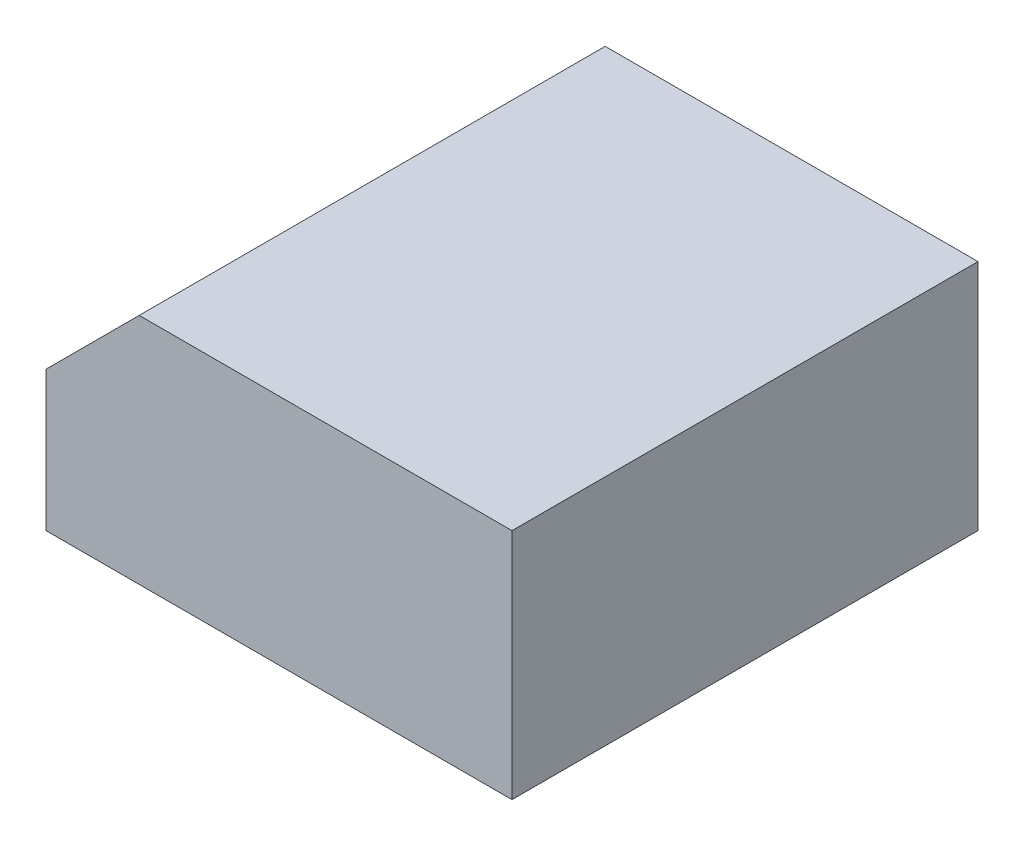
ISO-10303-21;
HEADER;
FILE_DESCRIPTION(('STEP AP214'),'2;1');
FILE_NAME('part.step','',(''),(''),'','','');
FILE_SCHEMA(('AUTOMOTIVE_DESIGN { 1 0 10303 214 1 1 1 1 }'));
ENDSEC;
DATA;
#1=APPLICATION_CONTEXT('core data for automotive mechanical design processes');
#2=APPLICATION_PROTOCOL_DEFINITION('international standard','automotive_design',2000,#1);
#3=PRODUCT_CONTEXT('',#1,'mechanical');
#4=PRODUCT('Part','Part','',(#3));
#5=PRODUCT_RELATED_PRODUCT_CATEGORY('part','',(#4));
#6=PRODUCT_DEFINITION_FORMATION('','',#4);
#7=PRODUCT_DEFINITION_CONTEXT('part definition',#1,'design');
#8=PRODUCT_DEFINITION('design','',#6,#7);
#9=PRODUCT_DEFINITION_SHAPE('','',#8);
#10=(LENGTH_UNIT() NAMED_UNIT(*) SI_UNIT(.MILLI.,.METRE.));
#11=(NAMED_UNIT(*) PLANE_ANGLE_UNIT() SI_UNIT($,.RADIAN.));
#12=(NAMED_UNIT(*) SI_UNIT($,.STERADIAN.) SOLID_ANGLE_UNIT());
#13=UNCERTAINTY_MEASURE_WITH_UNIT(LENGTH_MEASURE(1.E-05),#10,'distance_accuracy_value','');
#14=(GEOMETRIC_REPRESENTATION_CONTEXT(3) GLOBAL_UNCERTAINTY_ASSIGNED_CONTEXT((#13)) GLOBAL_UNIT_ASSIGNED_CONTEXT((#10,
#11,#12)) REPRESENTATION_CONTEXT('',''));
#15=CARTESIAN_POINT('',(0.,0.,0.));
#16=DIRECTION('',(0.,0.,1.));
#17=DIRECTION('',(1.,0.,0.));
#18=AXIS2_PLACEMENT_3D('',#15,#16,#17);
#19=CARTESIAN_POINT('',(-500.,0.,500.));
#20=DIRECTION('',(1.,0.,0.));
#21=DIRECTION('',(0.,0.,-1.));
#22=AXIS2_PLACEMENT_3D('',#19,#20,#21);
#23=PLANE('',#22);
#24=DIRECTION('',(0.,-1.,0.));
#25=VECTOR('',#24,1.);
#26=CARTESIAN_POINT('',(-500.,0.,-500.));
#27=LINE('',#26,#25);
#28=CARTESIAN_POINT('',(-500.,299.999999999999,-500.));
#29=VERTEX_POINT('',#28);
#30=CARTESIAN_POINT('',(-500.,0.,-500.));
#31=VERTEX_POINT('',#30);
#32=EDGE_CURVE('E142',#29,#31,#27,.T.);
#33=ORIENTED_EDGE('',*,*,#32,.T.);
#34=DIRECTION('',(0.,0.,-1.));
#35=VECTOR('',#34,1.);
#36=CARTESIAN_POINT('',(-500.,0.,500.));
#37=LINE('',#36,#35);
#38=CARTESIAN_POINT('',(-500.,0.,500.));
#39=VERTEX_POINT('',#38);
#40=EDGE_CURVE('E11',#39,#31,#37,.T.);
#41=ORIENTED_EDGE('',*,*,#40,.F.);
#42=DIRECTION('',(0.,-1.,0.));
#43=VECTOR('',#42,1.);
#44=CARTESIAN_POINT('',(-500.,0.,500.));
#45=LINE('',#44,#43);
#46=CARTESIAN_POINT('',(-500.,299.999999999999,500.));
#47=VERTEX_POINT('',#46);
#48=EDGE_CURVE('E146',#47,#39,#45,.T.);
#49=ORIENTED_EDGE('',*,*,#48,.F.);
#50=DIRECTION('',(0.,0.,-1.));
#51=VECTOR('',#50,1.);
#52=CARTESIAN_POINT('',(-500.,299.999999999999,500.));
#53=LINE('',#52,#51);
#54=EDGE_CURVE('E158',#47,#29,#53,.T.);
#55=ORIENTED_EDGE('',*,*,#54,.T.);
#56=EDGE_LOOP('',(#33,#41,#49,#55));
#57=FACE_BOUND('',#56,.T.);
#58=ADVANCED_FACE('F38',(#57),#23,.F.);
#59=CARTESIAN_POINT('',(-500.,0.,500.));
#60=DIRECTION('',(0.,1.,0.));
#61=DIRECTION('',(-1.,0.,0.));
#62=AXIS2_PLACEMENT_3D('',#59,#60,#61);
#63=PLANE('',#62);
#64=DIRECTION('',(1.,0.,0.));
#65=VECTOR('',#64,1.);
#66=CARTESIAN_POINT('',(-500.,0.,-500.));
#67=LINE('',#66,#65);
#68=CARTESIAN_POINT('',(500.,1.83697019872103E-13,-500.));
#69=VERTEX_POINT('',#68);
#70=EDGE_CURVE('E161',#31,#69,#67,.T.);
#71=ORIENTED_EDGE('',*,*,#70,.T.);
#72=DIRECTION('',(0.,0.,-1.));
#73=VECTOR('',#72,1.);
#74=CARTESIAN_POINT('',(500.,1.83697019872103E-13,500.));
#75=LINE('',#74,#73);
#76=CARTESIAN_POINT('',(500.,1.83697019872103E-13,500.));
#77=VERTEX_POINT('',#76);
#78=EDGE_CURVE('E46',#77,#69,#75,.T.);
#79=ORIENTED_EDGE('',*,*,#78,.F.);
#80=DIRECTION('',(1.,0.,0.));
#81=VECTOR('',#80,1.);
#82=CARTESIAN_POINT('',(-500.,0.,500.));
#83=LINE('',#82,#81);
#84=EDGE_CURVE('E149',#39,#77,#83,.T.);
#85=ORIENTED_EDGE('',*,*,#84,.F.);
#86=ORIENTED_EDGE('',*,*,#40,.T.);
#87=EDGE_LOOP('',(#71,#79,#85,#86));
#88=FACE_BOUND('',#87,.T.);
#89=ADVANCED_FACE('F200',(#88),#63,.F.);
#90=CARTESIAN_POINT('',(500.,500.,500.));
#91=DIRECTION('',(-1.,0.,0.));
#92=DIRECTION('',(0.,0.,1.));
#93=AXIS2_PLACEMENT_3D('',#90,#91,#92);
#94=PLANE('',#93);
#95=DIRECTION('',(0.,1.,0.));
#96=VECTOR('',#95,1.);
#97=CARTESIAN_POINT('',(500.,500.,-500.));
#98=LINE('',#97,#96);
#99=CARTESIAN_POINT('',(500.,500.,-500.));
#100=VERTEX_POINT('',#99);
#101=EDGE_CURVE('E163',#69,#100,#98,.T.);
#102=ORIENTED_EDGE('',*,*,#101,.T.);
#103=DIRECTION('',(0.,0.,-1.));
#104=VECTOR('',#103,1.);
#105=CARTESIAN_POINT('',(500.,500.,500.));
#106=LINE('',#105,#104);
#107=CARTESIAN_POINT('',(500.,500.,500.));
#108=VERTEX_POINT('',#107);
#109=EDGE_CURVE('E173',#108,#100,#106,.T.);
#110=ORIENTED_EDGE('',*,*,#109,.F.);
#111=DIRECTION('',(0.,1.,0.));
#112=VECTOR('',#111,1.);
#113=CARTESIAN_POINT('',(500.,500.,500.));
#114=LINE('',#113,#112);
#115=EDGE_CURVE('E152',#77,#108,#114,.T.);
#116=ORIENTED_EDGE('',*,*,#115,.F.);
#117=ORIENTED_EDGE('',*,*,#78,.T.);
#118=EDGE_LOOP('',(#102,#110,#116,#117));
#119=FACE_BOUND('',#118,.T.);
#120=ADVANCED_FACE('F180',(#119),#94,.F.);
#121=CARTESIAN_POINT('',(-300.,500.,500.));
#122=DIRECTION('',(0.,-1.,0.));
#123=DIRECTION('',(1.,0.,0.));
#124=AXIS2_PLACEMENT_3D('',#121,#122,#123);
#125=PLANE('',#124);
#126=DIRECTION('',(-1.,0.,0.));
#127=VECTOR('',#126,1.);
#128=CARTESIAN_POINT('',(-300.,500.,-500.));
#129=LINE('',#128,#127);
#130=CARTESIAN_POINT('',(-300.,500.,-500.));
#131=VERTEX_POINT('',#130);
#132=EDGE_CURVE('E165',#100,#131,#129,.T.);
#133=ORIENTED_EDGE('',*,*,#132,.T.);
#134=DIRECTION('',(0.,0.,-1.));
#135=VECTOR('',#134,1.);
#136=CARTESIAN_POINT('',(-300.,500.,500.));
#137=LINE('',#136,#135);
#138=CARTESIAN_POINT('',(-300.,500.,500.));
#139=VERTEX_POINT('',#138);
#140=EDGE_CURVE('E170',#139,#131,#137,.T.);
#141=ORIENTED_EDGE('',*,*,#140,.F.);
#142=DIRECTION('',(-1.,0.,0.));
#143=VECTOR('',#142,1.);
#144=CARTESIAN_POINT('',(-300.,500.,500.));
#145=LINE('',#144,#143);
#146=EDGE_CURVE('E154',#108,#139,#145,.T.);
#147=ORIENTED_EDGE('',*,*,#146,.F.);
#148=ORIENTED_EDGE('',*,*,#109,.T.);
#149=EDGE_LOOP('',(#133,#141,#147,#148));
#150=FACE_BOUND('',#149,.T.);
#151=ADVANCED_FACE('F190',(#150),#125,.F.);
#152=CARTESIAN_POINT('',(-500.,299.999999999999,500.));
#153=DIRECTION('',(0.707106781186549,-0.707106781186546,0.));
#154=DIRECTION('',(0.707106781186546,0.707106781186549,0.));
#155=AXIS2_PLACEMENT_3D('',#152,#153,#154);
#156=PLANE('',#155);
#157=DIRECTION('',(-0.707106781186546,-0.707106781186549,0.));
#158=VECTOR('',#157,1.);
#159=CARTESIAN_POINT('',(-500.,299.999999999999,-500.));
#160=LINE('',#159,#158);
#161=EDGE_CURVE('E150',#131,#29,#160,.T.);
#162=ORIENTED_EDGE('',*,*,#161,.T.);
#163=ORIENTED_EDGE('',*,*,#54,.F.);
#164=DIRECTION('',(-0.707106781186546,-0.707106781186549,0.));
#165=VECTOR('',#164,1.);
#166=CARTESIAN_POINT('',(-500.,299.999999999999,500.));
#167=LINE('',#166,#165);
#168=EDGE_CURVE('E156',#139,#47,#167,.T.);
#169=ORIENTED_EDGE('',*,*,#168,.F.);
#170=ORIENTED_EDGE('',*,*,#140,.T.);
#171=EDGE_LOOP('',(#162,#163,#169,#170));
#172=FACE_BOUND('',#171,.T.);
#173=ADVANCED_FACE('F194',(#172),#156,.F.);
#174=CARTESIAN_POINT('',(0.,0.,500.));
#175=DIRECTION('',(0.,0.,-1.));
#176=DIRECTION('',(-1.,0.,0.));
#177=AXIS2_PLACEMENT_3D('',#174,#175,#176);
#178=PLANE('',#177);
#179=ORIENTED_EDGE('',*,*,#48,.T.);
#180=ORIENTED_EDGE('',*,*,#84,.T.);
#181=ORIENTED_EDGE('',*,*,#115,.T.);
#182=ORIENTED_EDGE('',*,*,#146,.T.);
#183=ORIENTED_EDGE('',*,*,#168,.T.);
#184=EDGE_LOOP('',(#179,#180,#181,#182,#183));
#185=FACE_BOUND('',#184,.T.);
#186=ADVANCED_FACE('F198',(#185),#178,.F.);
#187=CARTESIAN_POINT('',(0.,0.,-500.));
#188=DIRECTION('',(0.,0.,-1.));
#189=DIRECTION('',(-1.,0.,0.));
#190=AXIS2_PLACEMENT_3D('',#187,#188,#189);
#191=PLANE('',#190);
#192=ORIENTED_EDGE('',*,*,#32,.F.);
#193=ORIENTED_EDGE('',*,*,#161,.F.);
#194=ORIENTED_EDGE('',*,*,#132,.F.);
#195=ORIENTED_EDGE('',*,*,#101,.F.);
#196=ORIENTED_EDGE('',*,*,#70,.F.);
#197=EDGE_LOOP('',(#192,#193,#194,#195,#196));
#198=FACE_BOUND('',#197,.T.);
#199=ADVANCED_FACE('F186',(#198),#191,.T.);
#200=CLOSED_SHELL('',(#58,#89,#120,#151,#173,#186,#199));
#201=CARTESIAN_POINT('',(0.,490.,0.));
#202=DIRECTION('',(0.,1.,0.));
#203=DIRECTION('',(-1.,0.,0.));
#204=AXIS2_PLACEMENT_3D('',#201,#202,#203);
#205=PLANE('',#204);
#206=DIRECTION('',(0.,0.,1.));
#207=VECTOR('',#206,1.);
#208=CARTESIAN_POINT('',(-275.,490.,-475.));
#209=LINE('',#208,#207);
#210=CARTESIAN_POINT('',(-275.,490.,-475.));
#211=VERTEX_POINT('',#210);
#212=CARTESIAN_POINT('',(-275.,490.,475.));
#213=VERTEX_POINT('',#212);
#214=EDGE_CURVE('E123',#211,#213,#209,.T.);
#215=ORIENTED_EDGE('',*,*,#214,.F.);
#216=DIRECTION('',(-1.,0.,0.));
#217=VECTOR('',#216,1.);
#218=CARTESIAN_POINT('',(-275.,490.,-475.));
#219=LINE('',#218,#217);
#220=CARTESIAN_POINT('',(475.,490.,-475.));
#221=VERTEX_POINT('',#220);
#222=EDGE_CURVE('E53',#221,#211,#219,.T.);
#223=ORIENTED_EDGE('',*,*,#222,.F.);
#224=DIRECTION('',(0.,0.,-1.));
#225=VECTOR('',#224,1.);
#226=CARTESIAN_POINT('',(475.,490.,-475.));
#227=LINE('',#226,#225);
#228=CARTESIAN_POINT('',(475.,490.,475.));
#229=VERTEX_POINT('',#228);
#230=EDGE_CURVE('E61',#229,#221,#227,.T.);
#231=ORIENTED_EDGE('',*,*,#230,.F.);
#232=DIRECTION('',(1.,0.,0.));
#233=VECTOR('',#232,1.);
#234=CARTESIAN_POINT('',(-275.,490.,475.));
#235=LINE('',#234,#233);
#236=EDGE_CURVE('E113',#213,#229,#235,.T.);
#237=ORIENTED_EDGE('',*,*,#236,.F.);
#238=EDGE_LOOP('',(#215,#223,#231,#237));
#239=FACE_BOUND('',#238,.T.);
#240=ADVANCED_FACE('F128',(#239),#205,.F.);
#241=CARTESIAN_POINT('',(0.,20.,0.));
#242=DIRECTION('',(0.,1.,0.));
#243=DIRECTION('',(-1.,0.,0.));
#244=AXIS2_PLACEMENT_3D('',#241,#242,#243);
#245=PLANE('',#244);
#246=DIRECTION('',(0.,0.,1.));
#247=VECTOR('',#246,1.);
#248=CARTESIAN_POINT('',(-275.,20.,-475.));
#249=LINE('',#248,#247);
#250=CARTESIAN_POINT('',(-275.,20.,-475.));
#251=VERTEX_POINT('',#250);
#252=CARTESIAN_POINT('',(-275.,20.,475.));
#253=VERTEX_POINT('',#252);
#254=EDGE_CURVE('E133',#251,#253,#249,.T.);
#255=ORIENTED_EDGE('',*,*,#254,.T.);
#256=DIRECTION('',(1.,0.,0.));
#257=VECTOR('',#256,1.);
#258=CARTESIAN_POINT('',(-275.,20.,475.));
#259=LINE('',#258,#257);
#260=CARTESIAN_POINT('',(475.,20.,475.));
#261=VERTEX_POINT('',#260);
#262=EDGE_CURVE('E115',#253,#261,#259,.T.);
#263=ORIENTED_EDGE('',*,*,#262,.T.);
#264=DIRECTION('',(0.,0.,-1.));
#265=VECTOR('',#264,1.);
#266=CARTESIAN_POINT('',(475.,20.,-475.));
#267=LINE('',#266,#265);
#268=CARTESIAN_POINT('',(475.,20.,-475.));
#269=VERTEX_POINT('',#268);
#270=EDGE_CURVE('E136',#261,#269,#267,.T.);
#271=ORIENTED_EDGE('',*,*,#270,.T.);
#272=DIRECTION('',(-1.,0.,0.));
#273=VECTOR('',#272,1.);
#274=CARTESIAN_POINT('',(-275.,20.,-475.));
#275=LINE('',#274,#273);
#276=EDGE_CURVE('E120',#269,#251,#275,.T.);
#277=ORIENTED_EDGE('',*,*,#276,.T.);
#278=EDGE_LOOP('',(#255,#263,#271,#277));
#279=FACE_BOUND('',#278,.T.);
#280=ADVANCED_FACE('F226',(#279),#245,.T.);
#281=CARTESIAN_POINT('',(-275.,20.,475.));
#282=DIRECTION('',(0.,0.,1.));
#283=DIRECTION('',(1.,0.,0.));
#284=AXIS2_PLACEMENT_3D('',#281,#282,#283);
#285=PLANE('',#284);
#286=ORIENTED_EDGE('',*,*,#236,.T.);
#287=DIRECTION('',(0.,1.,0.));
#288=VECTOR('',#287,1.);
#289=CARTESIAN_POINT('',(475.,20.,475.));
#290=LINE('',#289,#288);
#291=EDGE_CURVE('E119',#261,#229,#290,.T.);
#292=ORIENTED_EDGE('',*,*,#291,.F.);
#293=ORIENTED_EDGE('',*,*,#262,.F.);
#294=DIRECTION('',(0.,1.,0.));
#295=VECTOR('',#294,1.);
#296=CARTESIAN_POINT('',(-275.,20.,475.));
#297=LINE('',#296,#295);
#298=EDGE_CURVE('E109',#253,#213,#297,.T.);
#299=ORIENTED_EDGE('',*,*,#298,.T.);
#300=EDGE_LOOP('',(#286,#292,#293,#299));
#301=FACE_BOUND('',#300,.T.);
#302=ADVANCED_FACE('F111',(#301),#285,.F.);
#303=CARTESIAN_POINT('',(475.,20.,-475.));
#304=DIRECTION('',(1.,0.,0.));
#305=DIRECTION('',(0.,0.,-1.));
#306=AXIS2_PLACEMENT_3D('',#303,#304,#305);
#307=PLANE('',#306);
#308=ORIENTED_EDGE('',*,*,#230,.T.);
#309=DIRECTION('',(0.,1.,0.));
#310=VECTOR('',#309,1.);
#311=CARTESIAN_POINT('',(475.,20.,-475.));
#312=LINE('',#311,#310);
#313=EDGE_CURVE('E143',#269,#221,#312,.T.);
#314=ORIENTED_EDGE('',*,*,#313,.F.);
#315=ORIENTED_EDGE('',*,*,#270,.F.);
#316=ORIENTED_EDGE('',*,*,#291,.T.);
#317=EDGE_LOOP('',(#308,#314,#315,#316));
#318=FACE_BOUND('',#317,.T.);
#319=ADVANCED_FACE('F225',(#318),#307,.F.);
#320=CARTESIAN_POINT('',(-275.,20.,-475.));
#321=DIRECTION('',(0.,0.,-1.));
#322=DIRECTION('',(-1.,0.,0.));
#323=AXIS2_PLACEMENT_3D('',#320,#321,#322);
#324=PLANE('',#323);
#325=ORIENTED_EDGE('',*,*,#222,.T.);
#326=DIRECTION('',(0.,1.,0.));
#327=VECTOR('',#326,1.);
#328=CARTESIAN_POINT('',(-275.,20.,-475.));
#329=LINE('',#328,#327);
#330=EDGE_CURVE('E125',#251,#211,#329,.T.);
#331=ORIENTED_EDGE('',*,*,#330,.F.);
#332=ORIENTED_EDGE('',*,*,#276,.F.);
#333=ORIENTED_EDGE('',*,*,#313,.T.);
#334=EDGE_LOOP('',(#325,#331,#332,#333));
#335=FACE_BOUND('',#334,.T.);
#336=ADVANCED_FACE('F221',(#335),#324,.F.);
#337=CARTESIAN_POINT('',(-275.,20.,-475.));
#338=DIRECTION('',(-1.,0.,0.));
#339=DIRECTION('',(0.,0.,1.));
#340=AXIS2_PLACEMENT_3D('',#337,#338,#339);
#341=PLANE('',#340);
#342=ORIENTED_EDGE('',*,*,#214,.T.);
#343=ORIENTED_EDGE('',*,*,#298,.F.);
#344=ORIENTED_EDGE('',*,*,#254,.F.);
#345=ORIENTED_EDGE('',*,*,#330,.T.);
#346=EDGE_LOOP('',(#342,#343,#344,#345));
#347=FACE_BOUND('',#346,.T.);
#348=ADVANCED_FACE('F124',(#347),#341,.F.);
#349=CLOSED_SHELL('',(#240,#280,#302,#319,#336,#348));
#350=ORIENTED_CLOSED_SHELL('',*,#349,.T.);
#351=BREP_WITH_VOIDS('B2',#200,(#350));
#352=ADVANCED_BREP_SHAPE_REPRESENTATION('',(#18,#351),#14);
#353=SHAPE_DEFINITION_REPRESENTATION(#9,#352);
ENDSEC;
END-ISO-10303-21;
